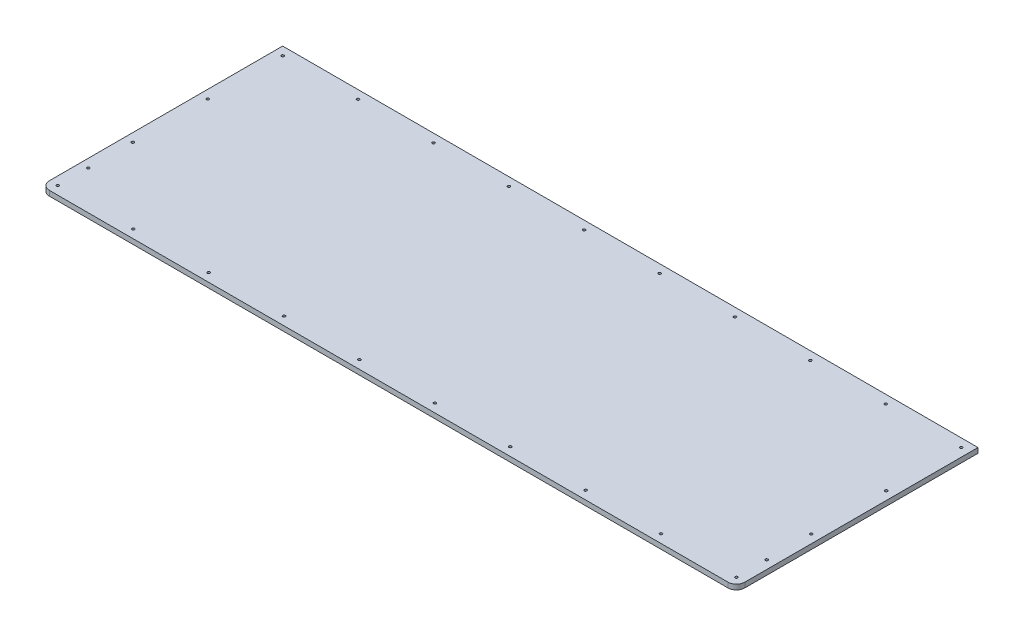
ISO-10303-21;
HEADER;
FILE_DESCRIPTION(('STEP AP214'),'2;1');
FILE_NAME('part.step','',(''),(''),'','','');
FILE_SCHEMA(('AUTOMOTIVE_DESIGN { 1 0 10303 214 1 1 1 1 }'));
ENDSEC;
DATA;
#1=APPLICATION_CONTEXT('core data for automotive mechanical design processes');
#2=APPLICATION_PROTOCOL_DEFINITION('international standard','automotive_design',2000,#1);
#3=PRODUCT_CONTEXT('',#1,'mechanical');
#4=PRODUCT('Part','Part','',(#3));
#5=PRODUCT_RELATED_PRODUCT_CATEGORY('part','',(#4));
#6=PRODUCT_DEFINITION_FORMATION('','',#4);
#7=PRODUCT_DEFINITION_CONTEXT('part definition',#1,'design');
#8=PRODUCT_DEFINITION('design','',#6,#7);
#9=PRODUCT_DEFINITION_SHAPE('','',#8);
#10=(LENGTH_UNIT() NAMED_UNIT(*) SI_UNIT(.MILLI.,.METRE.));
#11=(NAMED_UNIT(*) PLANE_ANGLE_UNIT() SI_UNIT($,.RADIAN.));
#12=(NAMED_UNIT(*) SI_UNIT($,.STERADIAN.) SOLID_ANGLE_UNIT());
#13=UNCERTAINTY_MEASURE_WITH_UNIT(LENGTH_MEASURE(1.E-05),#10,'distance_accuracy_value','');
#14=(GEOMETRIC_REPRESENTATION_CONTEXT(3) GLOBAL_UNCERTAINTY_ASSIGNED_CONTEXT((#13)) GLOBAL_UNIT_ASSIGNED_CONTEXT((#10,
#11,#12)) REPRESENTATION_CONTEXT('',''));
#15=CARTESIAN_POINT('',(0.,0.,0.));
#16=DIRECTION('',(0.,0.,1.));
#17=DIRECTION('',(1.,0.,0.));
#18=AXIS2_PLACEMENT_3D('',#15,#16,#17);
#19=CARTESIAN_POINT('',(-148.314966814714,1511.94738981776,87.0447752973141));
#20=DIRECTION('',(0.,-1.,0.));
#21=DIRECTION('',(0.,0.,-1.));
#22=AXIS2_PLACEMENT_3D('',#19,#20,#21);
#23=CYLINDRICAL_SURFACE('',#22,10.);
#24=CARTESIAN_POINT('',(-148.314966814714,1505.94738981776,87.0447752973141));
#25=DIRECTION('',(0.,1.,0.));
#26=DIRECTION('',(0.,0.,1.));
#27=AXIS2_PLACEMENT_3D('',#24,#25,#26);
#28=CIRCLE('',#27,10.);
#29=CARTESIAN_POINT('',(-158.314966814714,1505.94738981776,87.0447752973141));
#30=VERTEX_POINT('',#29);
#31=CARTESIAN_POINT('',(-148.314966814714,1505.94738981776,97.0447752973141));
#32=VERTEX_POINT('',#31);
#33=EDGE_CURVE('E137',#30,#32,#28,.T.);
#34=ORIENTED_EDGE('',*,*,#33,.T.);
#35=DIRECTION('',(0.,-1.,0.));
#36=VECTOR('',#35,1.);
#37=CARTESIAN_POINT('',(-148.314966814714,1511.94738981776,97.0447752973141));
#38=LINE('',#37,#36);
#39=CARTESIAN_POINT('',(-148.314966814714,1511.94738981776,97.0447752973141));
#40=VERTEX_POINT('',#39);
#41=EDGE_CURVE('E160',#40,#32,#38,.T.);
#42=ORIENTED_EDGE('',*,*,#41,.F.);
#43=CARTESIAN_POINT('',(-148.314966814714,1511.94738981776,87.0447752973141));
#44=DIRECTION('',(0.,1.,0.));
#45=DIRECTION('',(0.,0.,1.));
#46=AXIS2_PLACEMENT_3D('',#43,#44,#45);
#47=CIRCLE('',#46,10.);
#48=CARTESIAN_POINT('',(-158.314966814714,1511.94738981776,87.0447752973141));
#49=VERTEX_POINT('',#48);
#50=EDGE_CURVE('E152',#49,#40,#47,.T.);
#51=ORIENTED_EDGE('',*,*,#50,.F.);
#52=DIRECTION('',(0.,-1.,0.));
#53=VECTOR('',#52,1.);
#54=CARTESIAN_POINT('',(-158.314966814714,1511.94738981776,87.0447752973141));
#55=LINE('',#54,#53);
#56=EDGE_CURVE('E133',#49,#30,#55,.T.);
#57=ORIENTED_EDGE('',*,*,#56,.T.);
#58=EDGE_LOOP('',(#34,#42,#51,#57));
#59=FACE_BOUND('',#58,.T.);
#60=ADVANCED_FACE('F41',(#59),#23,.T.);
#61=CARTESIAN_POINT('',(657.685033185286,1511.94738981776,97.044775297314));
#62=DIRECTION('',(0.,0.,-1.));
#63=DIRECTION('',(-1.,0.,0.));
#64=AXIS2_PLACEMENT_3D('',#61,#62,#63);
#65=PLANE('',#64);
#66=DIRECTION('',(1.,0.,0.));
#67=VECTOR('',#66,1.);
#68=CARTESIAN_POINT('',(657.685033185286,1505.94738981776,97.044775297314));
#69=LINE('',#68,#67);
#70=CARTESIAN_POINT('',(657.685033185286,1505.94738981776,97.044775297314));
#71=VERTEX_POINT('',#70);
#72=EDGE_CURVE('E141',#32,#71,#69,.T.);
#73=ORIENTED_EDGE('',*,*,#72,.T.);
#74=DIRECTION('',(0.,-1.,0.));
#75=VECTOR('',#74,1.);
#76=CARTESIAN_POINT('',(657.685033185286,1511.94738981776,97.044775297314));
#77=LINE('',#76,#75);
#78=CARTESIAN_POINT('',(657.685033185286,1511.94738981776,97.044775297314));
#79=VERTEX_POINT('',#78);
#80=EDGE_CURVE('E157',#79,#71,#77,.T.);
#81=ORIENTED_EDGE('',*,*,#80,.F.);
#82=DIRECTION('',(1.,0.,0.));
#83=VECTOR('',#82,1.);
#84=CARTESIAN_POINT('',(657.685033185286,1511.94738981776,97.044775297314));
#85=LINE('',#84,#83);
#86=EDGE_CURVE('E101',#40,#79,#85,.T.);
#87=ORIENTED_EDGE('',*,*,#86,.F.);
#88=ORIENTED_EDGE('',*,*,#41,.T.);
#89=EDGE_LOOP('',(#73,#81,#87,#88));
#90=FACE_BOUND('',#89,.T.);
#91=ADVANCED_FACE('F234',(#90),#65,.F.);
#92=CARTESIAN_POINT('',(657.685033185286,1511.94738981776,87.044775297314));
#93=DIRECTION('',(0.,-1.,0.));
#94=DIRECTION('',(0.,0.,-1.));
#95=AXIS2_PLACEMENT_3D('',#92,#93,#94);
#96=CYLINDRICAL_SURFACE('',#95,9.99999999999995);
#97=CARTESIAN_POINT('',(657.685033185286,1505.94738981776,87.044775297314));
#98=DIRECTION('',(0.,1.,0.));
#99=DIRECTION('',(0.,0.,-1.));
#100=AXIS2_PLACEMENT_3D('',#97,#98,#99);
#101=CIRCLE('',#100,9.99999999999995);
#102=CARTESIAN_POINT('',(667.685033185286,1505.94738981776,87.044775297314));
#103=VERTEX_POINT('',#102);
#104=EDGE_CURVE('E145',#71,#103,#101,.T.);
#105=ORIENTED_EDGE('',*,*,#104,.T.);
#106=DIRECTION('',(0.,-1.,0.));
#107=VECTOR('',#106,1.);
#108=CARTESIAN_POINT('',(667.685033185286,1511.94738981776,87.044775297314));
#109=LINE('',#108,#107);
#110=CARTESIAN_POINT('',(667.685033185286,1511.94738981776,87.044775297314));
#111=VERTEX_POINT('',#110);
#112=EDGE_CURVE('E124',#111,#103,#109,.T.);
#113=ORIENTED_EDGE('',*,*,#112,.F.);
#114=CARTESIAN_POINT('',(657.685033185286,1511.94738981776,87.044775297314));
#115=DIRECTION('',(0.,1.,0.));
#116=DIRECTION('',(0.,0.,-1.));
#117=AXIS2_PLACEMENT_3D('',#114,#115,#116);
#118=CIRCLE('',#117,9.99999999999995);
#119=EDGE_CURVE('E115',#79,#111,#118,.T.);
#120=ORIENTED_EDGE('',*,*,#119,.F.);
#121=ORIENTED_EDGE('',*,*,#80,.T.);
#122=EDGE_LOOP('',(#105,#113,#120,#121));
#123=FACE_BOUND('',#122,.T.);
#124=ADVANCED_FACE('F240',(#123),#96,.T.);
#125=CARTESIAN_POINT('',(667.685033185286,1511.94738981776,-189.955224702686));
#126=DIRECTION('',(-1.,0.,0.));
#127=DIRECTION('',(0.,0.,1.));
#128=AXIS2_PLACEMENT_3D('',#125,#126,#127);
#129=PLANE('',#128);
#130=DIRECTION('',(0.,0.,-1.));
#131=VECTOR('',#130,1.);
#132=CARTESIAN_POINT('',(667.685033185286,1505.94738981776,-189.955224702686));
#133=LINE('',#132,#131);
#134=CARTESIAN_POINT('',(667.685033185286,1505.94738981776,-189.955224702686));
#135=VERTEX_POINT('',#134);
#136=EDGE_CURVE('E123',#103,#135,#133,.T.);
#137=ORIENTED_EDGE('',*,*,#136,.T.);
#138=DIRECTION('',(0.,-1.,0.));
#139=VECTOR('',#138,1.);
#140=CARTESIAN_POINT('',(667.685033185286,1511.94738981776,-189.955224702686));
#141=LINE('',#140,#139);
#142=CARTESIAN_POINT('',(667.685033185286,1511.94738981776,-189.955224702686));
#143=VERTEX_POINT('',#142);
#144=EDGE_CURVE('E120',#143,#135,#141,.T.);
#145=ORIENTED_EDGE('',*,*,#144,.F.);
#146=DIRECTION('',(0.,0.,-1.));
#147=VECTOR('',#146,1.);
#148=CARTESIAN_POINT('',(667.685033185286,1511.94738981776,-189.955224702686));
#149=LINE('',#148,#147);
#150=EDGE_CURVE('E108',#111,#143,#149,.T.);
#151=ORIENTED_EDGE('',*,*,#150,.F.);
#152=ORIENTED_EDGE('',*,*,#112,.T.);
#153=EDGE_LOOP('',(#137,#145,#151,#152));
#154=FACE_BOUND('',#153,.T.);
#155=ADVANCED_FACE('F121',(#154),#129,.F.);
#156=CARTESIAN_POINT('',(667.685033185286,1511.94738981776,-189.955224702686));
#157=DIRECTION('',(0.,0.,1.));
#158=DIRECTION('',(1.,0.,0.));
#159=AXIS2_PLACEMENT_3D('',#156,#157,#158);
#160=PLANE('',#159);
#161=DIRECTION('',(-1.,0.,0.));
#162=VECTOR('',#161,1.);
#163=CARTESIAN_POINT('',(667.685033185286,1505.94738981776,-189.955224702686));
#164=LINE('',#163,#162);
#165=CARTESIAN_POINT('',(-158.314966814714,1505.94738981776,-189.955224702686));
#166=VERTEX_POINT('',#165);
#167=EDGE_CURVE('E85',#135,#166,#164,.T.);
#168=ORIENTED_EDGE('',*,*,#167,.T.);
#169=DIRECTION('',(0.,-1.,0.));
#170=VECTOR('',#169,1.);
#171=CARTESIAN_POINT('',(-158.314966814714,1511.94738981776,-189.955224702686));
#172=LINE('',#171,#170);
#173=CARTESIAN_POINT('',(-158.314966814714,1511.94738981776,-189.955224702686));
#174=VERTEX_POINT('',#173);
#175=EDGE_CURVE('E125',#174,#166,#172,.T.);
#176=ORIENTED_EDGE('',*,*,#175,.F.);
#177=DIRECTION('',(-1.,0.,0.));
#178=VECTOR('',#177,1.);
#179=CARTESIAN_POINT('',(667.685033185286,1511.94738981776,-189.955224702686));
#180=LINE('',#179,#178);
#181=EDGE_CURVE('E113',#143,#174,#180,.T.);
#182=ORIENTED_EDGE('',*,*,#181,.F.);
#183=ORIENTED_EDGE('',*,*,#144,.T.);
#184=EDGE_LOOP('',(#168,#176,#182,#183));
#185=FACE_BOUND('',#184,.T.);
#186=ADVANCED_FACE('F127',(#185),#160,.F.);
#187=CARTESIAN_POINT('',(-158.314966814714,1511.94738981776,-189.955224702686));
#188=DIRECTION('',(1.,0.,0.));
#189=DIRECTION('',(0.,0.,-1.));
#190=AXIS2_PLACEMENT_3D('',#187,#188,#189);
#191=PLANE('',#190);
#192=DIRECTION('',(0.,0.,1.));
#193=VECTOR('',#192,1.);
#194=CARTESIAN_POINT('',(-158.314966814714,1505.94738981776,-189.955224702686));
#195=LINE('',#194,#193);
#196=EDGE_CURVE('E91',#166,#30,#195,.T.);
#197=ORIENTED_EDGE('',*,*,#196,.T.);
#198=ORIENTED_EDGE('',*,*,#56,.F.);
#199=DIRECTION('',(0.,0.,1.));
#200=VECTOR('',#199,1.);
#201=CARTESIAN_POINT('',(-158.314966814714,1511.94738981776,-189.955224702686));
#202=LINE('',#201,#200);
#203=EDGE_CURVE('E62',#174,#49,#202,.T.);
#204=ORIENTED_EDGE('',*,*,#203,.F.);
#205=ORIENTED_EDGE('',*,*,#175,.T.);
#206=EDGE_LOOP('',(#197,#198,#204,#205));
#207=FACE_BOUND('',#206,.T.);
#208=ADVANCED_FACE('F227',(#207),#191,.F.);
#209=CARTESIAN_POINT('',(-148.314966814714,1511.94738981776,87.0447752973141));
#210=DIRECTION('',(0.,1.,0.));
#211=DIRECTION('',(0.,0.,1.));
#212=AXIS2_PLACEMENT_3D('',#209,#210,#211);
#213=PLANE('',#212);
#214=CARTESIAN_POINT('',(657.685033185286,1511.94738981776,51.0447752973143));
#215=DIRECTION('',(0.,-1.,0.));
#216=DIRECTION('',(0.,0.,-1.));
#217=AXIS2_PLACEMENT_3D('',#214,#215,#216);
#218=CIRCLE('',#217,1.54999999999999);
#219=CARTESIAN_POINT('',(657.685033185286,1511.94738981776,49.4947752973143));
#220=VERTEX_POINT('',#219);
#221=EDGE_CURVE('E570',#220,#220,#218,.T.);
#222=ORIENTED_EDGE('',*,*,#221,.T.);
#223=EDGE_LOOP('',(#222));
#224=FACE_BOUND('',#223,.T.);
#225=CARTESIAN_POINT('',(-58.7549668147139,1511.94738981776,-179.955224702686));
#226=DIRECTION('',(0.,-1.,0.));
#227=DIRECTION('',(0.,0.,-1.));
#228=AXIS2_PLACEMENT_3D('',#225,#226,#227);
#229=CIRCLE('',#228,1.54999999999999);
#230=CARTESIAN_POINT('',(-58.7549668147139,1511.94738981776,-181.505224702686));
#231=VERTEX_POINT('',#230);
#232=EDGE_CURVE('E563',#231,#231,#229,.T.);
#233=ORIENTED_EDGE('',*,*,#232,.T.);
#234=EDGE_LOOP('',(#233));
#235=FACE_BOUND('',#234,.T.);
#236=CARTESIAN_POINT('',(30.8000331852861,1511.94738981776,-179.955224702686));
#237=DIRECTION('',(0.,-1.,0.));
#238=DIRECTION('',(0.,0.,-1.));
#239=AXIS2_PLACEMENT_3D('',#236,#237,#238);
#240=CIRCLE('',#239,1.54999999999999);
#241=CARTESIAN_POINT('',(30.8000331852861,1511.94738981776,-181.505224702686));
#242=VERTEX_POINT('',#241);
#243=EDGE_CURVE('E555',#242,#242,#240,.T.);
#244=ORIENTED_EDGE('',*,*,#243,.T.);
#245=EDGE_LOOP('',(#244));
#246=FACE_BOUND('',#245,.T.);
#247=CARTESIAN_POINT('',(120.355033185286,1511.94738981776,-179.955224702686));
#248=DIRECTION('',(0.,-1.,0.));
#249=DIRECTION('',(0.,0.,-1.));
#250=AXIS2_PLACEMENT_3D('',#247,#248,#249);
#251=CIRCLE('',#250,1.54999999999999);
#252=CARTESIAN_POINT('',(120.355033185286,1511.94738981776,-181.505224702686));
#253=VERTEX_POINT('',#252);
#254=EDGE_CURVE('E548',#253,#253,#251,.T.);
#255=ORIENTED_EDGE('',*,*,#254,.T.);
#256=EDGE_LOOP('',(#255));
#257=FACE_BOUND('',#256,.T.);
#258=CARTESIAN_POINT('',(209.910033185286,1511.94738981776,-179.955224702686));
#259=DIRECTION('',(0.,-1.,0.));
#260=DIRECTION('',(0.,0.,-1.));
#261=AXIS2_PLACEMENT_3D('',#258,#259,#260);
#262=CIRCLE('',#261,1.54999999999999);
#263=CARTESIAN_POINT('',(209.910033185286,1511.94738981776,-181.505224702686));
#264=VERTEX_POINT('',#263);
#265=EDGE_CURVE('E541',#264,#264,#262,.T.);
#266=ORIENTED_EDGE('',*,*,#265,.T.);
#267=EDGE_LOOP('',(#266));
#268=FACE_BOUND('',#267,.T.);
#269=CARTESIAN_POINT('',(299.465033185286,1511.94738981776,-179.955224702686));
#270=DIRECTION('',(0.,-1.,0.));
#271=DIRECTION('',(0.,0.,-1.));
#272=AXIS2_PLACEMENT_3D('',#269,#270,#271);
#273=CIRCLE('',#272,1.54999999999999);
#274=CARTESIAN_POINT('',(299.465033185286,1511.94738981776,-181.505224702686));
#275=VERTEX_POINT('',#274);
#276=EDGE_CURVE('E533',#275,#275,#273,.T.);
#277=ORIENTED_EDGE('',*,*,#276,.T.);
#278=EDGE_LOOP('',(#277));
#279=FACE_BOUND('',#278,.T.);
#280=CARTESIAN_POINT('',(389.020033185286,1511.94738981776,-179.955224702686));
#281=DIRECTION('',(0.,-1.,0.));
#282=DIRECTION('',(0.,0.,-1.));
#283=AXIS2_PLACEMENT_3D('',#280,#281,#282);
#284=CIRCLE('',#283,1.54999999999999);
#285=CARTESIAN_POINT('',(389.020033185286,1511.94738981776,-181.505224702686));
#286=VERTEX_POINT('',#285);
#287=EDGE_CURVE('E526',#286,#286,#284,.T.);
#288=ORIENTED_EDGE('',*,*,#287,.T.);
#289=EDGE_LOOP('',(#288));
#290=FACE_BOUND('',#289,.T.);
#291=CARTESIAN_POINT('',(478.575033185286,1511.94738981776,-179.955224702686));
#292=DIRECTION('',(0.,-1.,0.));
#293=DIRECTION('',(0.,0.,-1.));
#294=AXIS2_PLACEMENT_3D('',#291,#292,#293);
#295=CIRCLE('',#294,1.54999999999999);
#296=CARTESIAN_POINT('',(478.575033185286,1511.94738981776,-181.505224702686));
#297=VERTEX_POINT('',#296);
#298=EDGE_CURVE('E520',#297,#297,#295,.T.);
#299=ORIENTED_EDGE('',*,*,#298,.T.);
#300=EDGE_LOOP('',(#299));
#301=FACE_BOUND('',#300,.T.);
#302=CARTESIAN_POINT('',(568.130033185286,1511.94738981776,-179.955224702686));
#303=DIRECTION('',(0.,-1.,0.));
#304=DIRECTION('',(0.,0.,-1.));
#305=AXIS2_PLACEMENT_3D('',#302,#303,#304);
#306=CIRCLE('',#305,1.54999999999999);
#307=CARTESIAN_POINT('',(568.130033185286,1511.94738981776,-181.505224702686));
#308=VERTEX_POINT('',#307);
#309=EDGE_CURVE('E514',#308,#308,#306,.T.);
#310=ORIENTED_EDGE('',*,*,#309,.T.);
#311=EDGE_LOOP('',(#310));
#312=FACE_BOUND('',#311,.T.);
#313=CARTESIAN_POINT('',(657.685033185286,1511.94738981776,87.0447752973143));
#314=DIRECTION('',(0.,-1.,0.));
#315=DIRECTION('',(0.,0.,-1.));
#316=AXIS2_PLACEMENT_3D('',#313,#314,#315);
#317=CIRCLE('',#316,1.54999999999999);
#318=CARTESIAN_POINT('',(657.685033185286,1511.94738981776,85.4947752973143));
#319=VERTEX_POINT('',#318);
#320=EDGE_CURVE('E508',#319,#319,#317,.T.);
#321=ORIENTED_EDGE('',*,*,#320,.T.);
#322=EDGE_LOOP('',(#321));
#323=FACE_BOUND('',#322,.T.);
#324=CARTESIAN_POINT('',(657.685033185286,1511.94738981776,-1.95522470268575));
#325=DIRECTION('',(0.,-1.,0.));
#326=DIRECTION('',(0.,0.,-1.));
#327=AXIS2_PLACEMENT_3D('',#324,#325,#326);
#328=CIRCLE('',#327,1.54999999999999);
#329=CARTESIAN_POINT('',(657.685033185286,1511.94738981776,-3.50522470268574));
#330=VERTEX_POINT('',#329);
#331=EDGE_CURVE('E502',#330,#330,#328,.T.);
#332=ORIENTED_EDGE('',*,*,#331,.T.);
#333=EDGE_LOOP('',(#332));
#334=FACE_BOUND('',#333,.T.);
#335=CARTESIAN_POINT('',(657.685033185286,1511.94738981776,-90.9552247026857));
#336=DIRECTION('',(0.,-1.,0.));
#337=DIRECTION('',(0.,0.,-1.));
#338=AXIS2_PLACEMENT_3D('',#335,#336,#337);
#339=CIRCLE('',#338,1.54999999999999);
#340=CARTESIAN_POINT('',(657.685033185286,1511.94738981776,-92.5052247026857));
#341=VERTEX_POINT('',#340);
#342=EDGE_CURVE('E496',#341,#341,#339,.T.);
#343=ORIENTED_EDGE('',*,*,#342,.T.);
#344=EDGE_LOOP('',(#343));
#345=FACE_BOUND('',#344,.T.);
#346=CARTESIAN_POINT('',(657.685033185286,1511.94738981776,-179.955224702686));
#347=DIRECTION('',(0.,-1.,0.));
#348=DIRECTION('',(0.,0.,-1.));
#349=AXIS2_PLACEMENT_3D('',#346,#347,#348);
#350=CIRCLE('',#349,1.54999999999999);
#351=CARTESIAN_POINT('',(657.685033185286,1511.94738981776,-181.505224702686));
#352=VERTEX_POINT('',#351);
#353=EDGE_CURVE('E492',#352,#352,#350,.T.);
#354=ORIENTED_EDGE('',*,*,#353,.T.);
#355=EDGE_LOOP('',(#354));
#356=FACE_BOUND('',#355,.T.);
#357=CARTESIAN_POINT('',(-58.7599668147138,1511.94738981776,87.0447752973143));
#358=DIRECTION('',(0.,-1.,0.));
#359=DIRECTION('',(0.,0.,-1.));
#360=AXIS2_PLACEMENT_3D('',#357,#358,#359);
#361=CIRCLE('',#360,1.55000000000005);
#362=CARTESIAN_POINT('',(-58.7599668147138,1511.94738981776,85.4947752973142));
#363=VERTEX_POINT('',#362);
#364=EDGE_CURVE('E488',#363,#363,#361,.T.);
#365=ORIENTED_EDGE('',*,*,#364,.T.);
#366=EDGE_LOOP('',(#365));
#367=FACE_BOUND('',#366,.T.);
#368=CARTESIAN_POINT('',(-148.314966814714,1511.94738981776,51.0447752973143));
#369=DIRECTION('',(0.,-1.,0.));
#370=DIRECTION('',(0.,0.,-1.));
#371=AXIS2_PLACEMENT_3D('',#368,#369,#370);
#372=CIRCLE('',#371,1.55000000000005);
#373=CARTESIAN_POINT('',(-148.314966814714,1511.94738981776,49.4947752973142));
#374=VERTEX_POINT('',#373);
#375=EDGE_CURVE('E474',#374,#374,#372,.T.);
#376=ORIENTED_EDGE('',*,*,#375,.T.);
#377=EDGE_LOOP('',(#376));
#378=FACE_BOUND('',#377,.T.);
#379=CARTESIAN_POINT('',(-148.314966814714,1511.94738981776,-179.955224702686));
#380=DIRECTION('',(0.,-1.,0.));
#381=DIRECTION('',(0.,0.,-1.));
#382=AXIS2_PLACEMENT_3D('',#379,#380,#381);
#383=CIRCLE('',#382,1.55000000000005);
#384=CARTESIAN_POINT('',(-148.314966814714,1511.94738981776,-181.505224702686));
#385=VERTEX_POINT('',#384);
#386=EDGE_CURVE('E468',#385,#385,#383,.T.);
#387=ORIENTED_EDGE('',*,*,#386,.T.);
#388=EDGE_LOOP('',(#387));
#389=FACE_BOUND('',#388,.T.);
#390=CARTESIAN_POINT('',(-148.314966814714,1511.94738981776,-90.9552247026857));
#391=DIRECTION('',(0.,-1.,0.));
#392=DIRECTION('',(0.,0.,-1.));
#393=AXIS2_PLACEMENT_3D('',#390,#391,#392);
#394=CIRCLE('',#393,1.55000000000005);
#395=CARTESIAN_POINT('',(-148.314966814714,1511.94738981776,-92.5052247026858));
#396=VERTEX_POINT('',#395);
#397=EDGE_CURVE('E462',#396,#396,#394,.T.);
#398=ORIENTED_EDGE('',*,*,#397,.T.);
#399=EDGE_LOOP('',(#398));
#400=FACE_BOUND('',#399,.T.);
#401=CARTESIAN_POINT('',(-148.314966814714,1511.94738981776,-1.95522470268572));
#402=DIRECTION('',(0.,-1.,0.));
#403=DIRECTION('',(0.,0.,-1.));
#404=AXIS2_PLACEMENT_3D('',#401,#402,#403);
#405=CIRCLE('',#404,1.55000000000005);
#406=CARTESIAN_POINT('',(-148.314966814714,1511.94738981776,-3.50522470268577));
#407=VERTEX_POINT('',#406);
#408=EDGE_CURVE('E455',#407,#407,#405,.T.);
#409=ORIENTED_EDGE('',*,*,#408,.T.);
#410=EDGE_LOOP('',(#409));
#411=FACE_BOUND('',#410,.T.);
#412=CARTESIAN_POINT('',(-148.314966814714,1511.94738981776,87.0447752973143));
#413=DIRECTION('',(0.,-1.,0.));
#414=DIRECTION('',(0.,0.,-1.));
#415=AXIS2_PLACEMENT_3D('',#412,#413,#414);
#416=CIRCLE('',#415,1.55000000000005);
#417=CARTESIAN_POINT('',(-148.314966814714,1511.94738981776,85.4947752973142));
#418=VERTEX_POINT('',#417);
#419=EDGE_CURVE('E142',#418,#418,#416,.T.);
#420=ORIENTED_EDGE('',*,*,#419,.T.);
#421=EDGE_LOOP('',(#420));
#422=FACE_BOUND('',#421,.T.);
#423=ORIENTED_EDGE('',*,*,#50,.T.);
#424=ORIENTED_EDGE('',*,*,#86,.T.);
#425=ORIENTED_EDGE('',*,*,#119,.T.);
#426=ORIENTED_EDGE('',*,*,#150,.T.);
#427=ORIENTED_EDGE('',*,*,#181,.T.);
#428=ORIENTED_EDGE('',*,*,#203,.T.);
#429=EDGE_LOOP('',(#423,#424,#425,#426,#427,#428));
#430=FACE_BOUND('',#429,.T.);
#431=CARTESIAN_POINT('',(30.7950331852862,1511.94738981776,87.0447752973142));
#432=DIRECTION('',(0.,-1.,0.));
#433=DIRECTION('',(0.,0.,-1.));
#434=AXIS2_PLACEMENT_3D('',#431,#432,#433);
#435=CIRCLE('',#434,1.55000000000005);
#436=CARTESIAN_POINT('',(30.7950331852862,1511.94738981776,85.4947752973142));
#437=VERTEX_POINT('',#436);
#438=EDGE_CURVE('E163',#437,#437,#435,.T.);
#439=ORIENTED_EDGE('',*,*,#438,.T.);
#440=EDGE_LOOP('',(#439));
#441=FACE_BOUND('',#440,.T.);
#442=CARTESIAN_POINT('',(120.350033185286,1511.94738981776,87.0447752973142));
#443=DIRECTION('',(0.,-1.,0.));
#444=DIRECTION('',(0.,0.,-1.));
#445=AXIS2_PLACEMENT_3D('',#442,#443,#444);
#446=CIRCLE('',#445,1.55000000000005);
#447=CARTESIAN_POINT('',(120.350033185286,1511.94738981776,85.4947752973142));
#448=VERTEX_POINT('',#447);
#449=EDGE_CURVE('E171',#448,#448,#446,.T.);
#450=ORIENTED_EDGE('',*,*,#449,.T.);
#451=EDGE_LOOP('',(#450));
#452=FACE_BOUND('',#451,.T.);
#453=CARTESIAN_POINT('',(209.905033185286,1511.94738981776,87.0447752973142));
#454=DIRECTION('',(0.,-1.,0.));
#455=DIRECTION('',(0.,0.,-1.));
#456=AXIS2_PLACEMENT_3D('',#453,#454,#455);
#457=CIRCLE('',#456,1.55000000000005);
#458=CARTESIAN_POINT('',(209.905033185286,1511.94738981776,85.4947752973141));
#459=VERTEX_POINT('',#458);
#460=EDGE_CURVE('E179',#459,#459,#457,.T.);
#461=ORIENTED_EDGE('',*,*,#460,.T.);
#462=EDGE_LOOP('',(#461));
#463=FACE_BOUND('',#462,.T.);
#464=CARTESIAN_POINT('',(299.460033185286,1511.94738981776,87.0447752973142));
#465=DIRECTION('',(0.,-1.,0.));
#466=DIRECTION('',(0.,0.,-1.));
#467=AXIS2_PLACEMENT_3D('',#464,#465,#466);
#468=CIRCLE('',#467,1.55000000000005);
#469=CARTESIAN_POINT('',(299.460033185286,1511.94738981776,85.4947752973141));
#470=VERTEX_POINT('',#469);
#471=EDGE_CURVE('E187',#470,#470,#468,.T.);
#472=ORIENTED_EDGE('',*,*,#471,.T.);
#473=EDGE_LOOP('',(#472));
#474=FACE_BOUND('',#473,.T.);
#475=CARTESIAN_POINT('',(389.015033185286,1511.94738981776,87.0447752973142));
#476=DIRECTION('',(0.,-1.,0.));
#477=DIRECTION('',(0.,0.,-1.));
#478=AXIS2_PLACEMENT_3D('',#475,#476,#477);
#479=CIRCLE('',#478,1.55000000000005);
#480=CARTESIAN_POINT('',(389.015033185286,1511.94738981776,85.4947752973141));
#481=VERTEX_POINT('',#480);
#482=EDGE_CURVE('E193',#481,#481,#479,.T.);
#483=ORIENTED_EDGE('',*,*,#482,.T.);
#484=EDGE_LOOP('',(#483));
#485=FACE_BOUND('',#484,.T.);
#486=CARTESIAN_POINT('',(478.570033185286,1511.94738981776,87.0447752973141));
#487=DIRECTION('',(0.,-1.,0.));
#488=DIRECTION('',(0.,0.,-1.));
#489=AXIS2_PLACEMENT_3D('',#486,#487,#488);
#490=CIRCLE('',#489,1.55000000000005);
#491=CARTESIAN_POINT('',(478.570033185286,1511.94738981776,85.4947752973141));
#492=VERTEX_POINT('',#491);
#493=EDGE_CURVE('E199',#492,#492,#490,.T.);
#494=ORIENTED_EDGE('',*,*,#493,.T.);
#495=EDGE_LOOP('',(#494));
#496=FACE_BOUND('',#495,.T.);
#497=CARTESIAN_POINT('',(568.125033185286,1511.94738981776,87.0447752973141));
#498=DIRECTION('',(0.,-1.,0.));
#499=DIRECTION('',(0.,0.,-1.));
#500=AXIS2_PLACEMENT_3D('',#497,#498,#499);
#501=CIRCLE('',#500,1.55000000000005);
#502=CARTESIAN_POINT('',(568.125033185286,1511.94738981776,85.4947752973141));
#503=VERTEX_POINT('',#502);
#504=EDGE_CURVE('E51',#503,#503,#501,.T.);
#505=ORIENTED_EDGE('',*,*,#504,.T.);
#506=EDGE_LOOP('',(#505));
#507=FACE_BOUND('',#506,.T.);
#508=ADVANCED_FACE('F110',(#224,#235,#246,#257,#268,#279,#290,#301,#312,#323,#334,#345,#356,
#367,#378,#389,#400,#411,#422,#430,#441,#452,#463,#474,#485,#496,#507),#213,.T.);
#509=CARTESIAN_POINT('',(-148.314966814714,1505.94738981776,87.0447752973141));
#510=DIRECTION('',(0.,1.,0.));
#511=DIRECTION('',(0.,0.,1.));
#512=AXIS2_PLACEMENT_3D('',#509,#510,#511);
#513=PLANE('',#512);
#514=CARTESIAN_POINT('',(657.685033185286,1505.94738981776,51.0447752973143));
#515=DIRECTION('',(0.,-1.,0.));
#516=DIRECTION('',(0.,0.,-1.));
#517=AXIS2_PLACEMENT_3D('',#514,#515,#516);
#518=CIRCLE('',#517,1.54999999999999);
#519=CARTESIAN_POINT('',(657.685033185286,1505.94738981776,49.4947752973143));
#520=VERTEX_POINT('',#519);
#521=EDGE_CURVE('E573',#520,#520,#518,.T.);
#522=ORIENTED_EDGE('',*,*,#521,.F.);
#523=EDGE_LOOP('',(#522));
#524=FACE_BOUND('',#523,.T.);
#525=CARTESIAN_POINT('',(-58.7549668147139,1505.94738981776,-179.955224702686));
#526=DIRECTION('',(0.,-1.,0.));
#527=DIRECTION('',(0.,0.,-1.));
#528=AXIS2_PLACEMENT_3D('',#525,#526,#527);
#529=CIRCLE('',#528,1.54999999999999);
#530=CARTESIAN_POINT('',(-58.7549668147139,1505.94738981776,-181.505224702686));
#531=VERTEX_POINT('',#530);
#532=EDGE_CURVE('E567',#531,#531,#529,.T.);
#533=ORIENTED_EDGE('',*,*,#532,.F.);
#534=EDGE_LOOP('',(#533));
#535=FACE_BOUND('',#534,.T.);
#536=CARTESIAN_POINT('',(30.8000331852861,1505.94738981776,-179.955224702686));
#537=DIRECTION('',(0.,-1.,0.));
#538=DIRECTION('',(0.,0.,-1.));
#539=AXIS2_PLACEMENT_3D('',#536,#537,#538);
#540=CIRCLE('',#539,1.54999999999999);
#541=CARTESIAN_POINT('',(30.8000331852861,1505.94738981776,-181.505224702686));
#542=VERTEX_POINT('',#541);
#543=EDGE_CURVE('E559',#542,#542,#540,.T.);
#544=ORIENTED_EDGE('',*,*,#543,.F.);
#545=EDGE_LOOP('',(#544));
#546=FACE_BOUND('',#545,.T.);
#547=CARTESIAN_POINT('',(120.355033185286,1505.94738981776,-179.955224702686));
#548=DIRECTION('',(0.,-1.,0.));
#549=DIRECTION('',(0.,0.,-1.));
#550=AXIS2_PLACEMENT_3D('',#547,#548,#549);
#551=CIRCLE('',#550,1.54999999999999);
#552=CARTESIAN_POINT('',(120.355033185286,1505.94738981776,-181.505224702686));
#553=VERTEX_POINT('',#552);
#554=EDGE_CURVE('E551',#553,#553,#551,.T.);
#555=ORIENTED_EDGE('',*,*,#554,.F.);
#556=EDGE_LOOP('',(#555));
#557=FACE_BOUND('',#556,.T.);
#558=CARTESIAN_POINT('',(209.910033185286,1505.94738981776,-179.955224702686));
#559=DIRECTION('',(0.,-1.,0.));
#560=DIRECTION('',(0.,0.,-1.));
#561=AXIS2_PLACEMENT_3D('',#558,#559,#560);
#562=CIRCLE('',#561,1.54999999999999);
#563=CARTESIAN_POINT('',(209.910033185286,1505.94738981776,-181.505224702686));
#564=VERTEX_POINT('',#563);
#565=EDGE_CURVE('E544',#564,#564,#562,.T.);
#566=ORIENTED_EDGE('',*,*,#565,.F.);
#567=EDGE_LOOP('',(#566));
#568=FACE_BOUND('',#567,.T.);
#569=CARTESIAN_POINT('',(299.465033185286,1505.94738981776,-179.955224702686));
#570=DIRECTION('',(0.,-1.,0.));
#571=DIRECTION('',(0.,0.,-1.));
#572=AXIS2_PLACEMENT_3D('',#569,#570,#571);
#573=CIRCLE('',#572,1.54999999999999);
#574=CARTESIAN_POINT('',(299.465033185286,1505.94738981776,-181.505224702686));
#575=VERTEX_POINT('',#574);
#576=EDGE_CURVE('E537',#575,#575,#573,.T.);
#577=ORIENTED_EDGE('',*,*,#576,.F.);
#578=EDGE_LOOP('',(#577));
#579=FACE_BOUND('',#578,.T.);
#580=CARTESIAN_POINT('',(389.020033185286,1505.94738981776,-179.955224702686));
#581=DIRECTION('',(0.,-1.,0.));
#582=DIRECTION('',(0.,0.,-1.));
#583=AXIS2_PLACEMENT_3D('',#580,#581,#582);
#584=CIRCLE('',#583,1.54999999999999);
#585=CARTESIAN_POINT('',(389.020033185286,1505.94738981776,-181.505224702686));
#586=VERTEX_POINT('',#585);
#587=EDGE_CURVE('E529',#586,#586,#584,.T.);
#588=ORIENTED_EDGE('',*,*,#587,.F.);
#589=EDGE_LOOP('',(#588));
#590=FACE_BOUND('',#589,.T.);
#591=CARTESIAN_POINT('',(478.575033185286,1505.94738981776,-179.955224702686));
#592=DIRECTION('',(0.,-1.,0.));
#593=DIRECTION('',(0.,0.,-1.));
#594=AXIS2_PLACEMENT_3D('',#591,#592,#593);
#595=CIRCLE('',#594,1.54999999999999);
#596=CARTESIAN_POINT('',(478.575033185286,1505.94738981776,-181.505224702686));
#597=VERTEX_POINT('',#596);
#598=EDGE_CURVE('E523',#597,#597,#595,.T.);
#599=ORIENTED_EDGE('',*,*,#598,.F.);
#600=EDGE_LOOP('',(#599));
#601=FACE_BOUND('',#600,.T.);
#602=CARTESIAN_POINT('',(568.130033185286,1505.94738981776,-179.955224702686));
#603=DIRECTION('',(0.,-1.,0.));
#604=DIRECTION('',(0.,0.,-1.));
#605=AXIS2_PLACEMENT_3D('',#602,#603,#604);
#606=CIRCLE('',#605,1.54999999999999);
#607=CARTESIAN_POINT('',(568.130033185286,1505.94738981776,-181.505224702686));
#608=VERTEX_POINT('',#607);
#609=EDGE_CURVE('E517',#608,#608,#606,.T.);
#610=ORIENTED_EDGE('',*,*,#609,.F.);
#611=EDGE_LOOP('',(#610));
#612=FACE_BOUND('',#611,.T.);
#613=CARTESIAN_POINT('',(657.685033185286,1505.94738981776,87.0447752973143));
#614=DIRECTION('',(0.,-1.,0.));
#615=DIRECTION('',(0.,0.,-1.));
#616=AXIS2_PLACEMENT_3D('',#613,#614,#615);
#617=CIRCLE('',#616,1.54999999999999);
#618=CARTESIAN_POINT('',(657.685033185286,1505.94738981776,85.4947752973143));
#619=VERTEX_POINT('',#618);
#620=EDGE_CURVE('E511',#619,#619,#617,.T.);
#621=ORIENTED_EDGE('',*,*,#620,.F.);
#622=EDGE_LOOP('',(#621));
#623=FACE_BOUND('',#622,.T.);
#624=CARTESIAN_POINT('',(657.685033185286,1505.94738981776,-1.95522470268575));
#625=DIRECTION('',(0.,-1.,0.));
#626=DIRECTION('',(0.,0.,-1.));
#627=AXIS2_PLACEMENT_3D('',#624,#625,#626);
#628=CIRCLE('',#627,1.54999999999999);
#629=CARTESIAN_POINT('',(657.685033185286,1505.94738981776,-3.50522470268574));
#630=VERTEX_POINT('',#629);
#631=EDGE_CURVE('E505',#630,#630,#628,.T.);
#632=ORIENTED_EDGE('',*,*,#631,.F.);
#633=EDGE_LOOP('',(#632));
#634=FACE_BOUND('',#633,.T.);
#635=CARTESIAN_POINT('',(657.685033185286,1505.94738981776,-90.9552247026857));
#636=DIRECTION('',(0.,-1.,0.));
#637=DIRECTION('',(0.,0.,-1.));
#638=AXIS2_PLACEMENT_3D('',#635,#636,#637);
#639=CIRCLE('',#638,1.54999999999999);
#640=CARTESIAN_POINT('',(657.685033185286,1505.94738981776,-92.5052247026857));
#641=VERTEX_POINT('',#640);
#642=EDGE_CURVE('E499',#641,#641,#639,.T.);
#643=ORIENTED_EDGE('',*,*,#642,.F.);
#644=EDGE_LOOP('',(#643));
#645=FACE_BOUND('',#644,.T.);
#646=CARTESIAN_POINT('',(657.685033185286,1505.94738981776,-179.955224702686));
#647=DIRECTION('',(0.,-1.,0.));
#648=DIRECTION('',(0.,0.,-1.));
#649=AXIS2_PLACEMENT_3D('',#646,#647,#648);
#650=CIRCLE('',#649,1.54999999999999);
#651=CARTESIAN_POINT('',(657.685033185286,1505.94738981776,-181.505224702686));
#652=VERTEX_POINT('',#651);
#653=EDGE_CURVE('E493',#652,#652,#650,.T.);
#654=ORIENTED_EDGE('',*,*,#653,.F.);
#655=EDGE_LOOP('',(#654));
#656=FACE_BOUND('',#655,.T.);
#657=CARTESIAN_POINT('',(-58.7599668147138,1505.94738981776,87.0447752973143));
#658=DIRECTION('',(0.,-1.,0.));
#659=DIRECTION('',(0.,0.,-1.));
#660=AXIS2_PLACEMENT_3D('',#657,#658,#659);
#661=CIRCLE('',#660,1.55000000000005);
#662=CARTESIAN_POINT('',(-58.7599668147138,1505.94738981776,85.4947752973142));
#663=VERTEX_POINT('',#662);
#664=EDGE_CURVE('E481',#663,#663,#661,.T.);
#665=ORIENTED_EDGE('',*,*,#664,.F.);
#666=EDGE_LOOP('',(#665));
#667=FACE_BOUND('',#666,.T.);
#668=CARTESIAN_POINT('',(-148.314966814714,1505.94738981776,51.0447752973143));
#669=DIRECTION('',(0.,-1.,0.));
#670=DIRECTION('',(0.,0.,-1.));
#671=AXIS2_PLACEMENT_3D('',#668,#669,#670);
#672=CIRCLE('',#671,1.55000000000005);
#673=CARTESIAN_POINT('',(-148.314966814714,1505.94738981776,49.4947752973142));
#674=VERTEX_POINT('',#673);
#675=EDGE_CURVE('E477',#674,#674,#672,.T.);
#676=ORIENTED_EDGE('',*,*,#675,.F.);
#677=EDGE_LOOP('',(#676));
#678=FACE_BOUND('',#677,.T.);
#679=CARTESIAN_POINT('',(-148.314966814714,1505.94738981776,-179.955224702686));
#680=DIRECTION('',(0.,-1.,0.));
#681=DIRECTION('',(0.,0.,-1.));
#682=AXIS2_PLACEMENT_3D('',#679,#680,#681);
#683=CIRCLE('',#682,1.55000000000005);
#684=CARTESIAN_POINT('',(-148.314966814714,1505.94738981776,-181.505224702686));
#685=VERTEX_POINT('',#684);
#686=EDGE_CURVE('E471',#685,#685,#683,.T.);
#687=ORIENTED_EDGE('',*,*,#686,.F.);
#688=EDGE_LOOP('',(#687));
#689=FACE_BOUND('',#688,.T.);
#690=CARTESIAN_POINT('',(-148.314966814714,1505.94738981776,-90.9552247026857));
#691=DIRECTION('',(0.,-1.,0.));
#692=DIRECTION('',(0.,0.,-1.));
#693=AXIS2_PLACEMENT_3D('',#690,#691,#692);
#694=CIRCLE('',#693,1.55000000000005);
#695=CARTESIAN_POINT('',(-148.314966814714,1505.94738981776,-92.5052247026858));
#696=VERTEX_POINT('',#695);
#697=EDGE_CURVE('E465',#696,#696,#694,.T.);
#698=ORIENTED_EDGE('',*,*,#697,.F.);
#699=EDGE_LOOP('',(#698));
#700=FACE_BOUND('',#699,.T.);
#701=CARTESIAN_POINT('',(-148.314966814714,1505.94738981776,-1.95522470268572));
#702=DIRECTION('',(0.,-1.,0.));
#703=DIRECTION('',(0.,0.,-1.));
#704=AXIS2_PLACEMENT_3D('',#701,#702,#703);
#705=CIRCLE('',#704,1.55000000000005);
#706=CARTESIAN_POINT('',(-148.314966814714,1505.94738981776,-3.50522470268577));
#707=VERTEX_POINT('',#706);
#708=EDGE_CURVE('E459',#707,#707,#705,.T.);
#709=ORIENTED_EDGE('',*,*,#708,.F.);
#710=EDGE_LOOP('',(#709));
#711=FACE_BOUND('',#710,.T.);
#712=CARTESIAN_POINT('',(-148.314966814714,1505.94738981776,87.0447752973143));
#713=DIRECTION('',(0.,-1.,0.));
#714=DIRECTION('',(0.,0.,-1.));
#715=AXIS2_PLACEMENT_3D('',#712,#713,#714);
#716=CIRCLE('',#715,1.55000000000005);
#717=CARTESIAN_POINT('',(-148.314966814714,1505.94738981776,85.4947752973142));
#718=VERTEX_POINT('',#717);
#719=EDGE_CURVE('E451',#718,#718,#716,.T.);
#720=ORIENTED_EDGE('',*,*,#719,.F.);
#721=EDGE_LOOP('',(#720));
#722=FACE_BOUND('',#721,.T.);
#723=ORIENTED_EDGE('',*,*,#33,.F.);
#724=ORIENTED_EDGE('',*,*,#196,.F.);
#725=ORIENTED_EDGE('',*,*,#167,.F.);
#726=ORIENTED_EDGE('',*,*,#136,.F.);
#727=ORIENTED_EDGE('',*,*,#104,.F.);
#728=ORIENTED_EDGE('',*,*,#72,.F.);
#729=EDGE_LOOP('',(#723,#724,#725,#726,#727,#728));
#730=FACE_BOUND('',#729,.T.);
#731=CARTESIAN_POINT('',(30.7950331852862,1505.94738981776,87.0447752973142));
#732=DIRECTION('',(0.,-1.,0.));
#733=DIRECTION('',(0.,0.,-1.));
#734=AXIS2_PLACEMENT_3D('',#731,#732,#733);
#735=CIRCLE('',#734,1.55000000000005);
#736=CARTESIAN_POINT('',(30.7950331852862,1505.94738981776,85.4947752973142));
#737=VERTEX_POINT('',#736);
#738=EDGE_CURVE('E167',#737,#737,#735,.T.);
#739=ORIENTED_EDGE('',*,*,#738,.F.);
#740=EDGE_LOOP('',(#739));
#741=FACE_BOUND('',#740,.T.);
#742=CARTESIAN_POINT('',(120.350033185286,1505.94738981776,87.0447752973142));
#743=DIRECTION('',(0.,-1.,0.));
#744=DIRECTION('',(0.,0.,-1.));
#745=AXIS2_PLACEMENT_3D('',#742,#743,#744);
#746=CIRCLE('',#745,1.55000000000005);
#747=CARTESIAN_POINT('',(120.350033185286,1505.94738981776,85.4947752973142));
#748=VERTEX_POINT('',#747);
#749=EDGE_CURVE('E175',#748,#748,#746,.T.);
#750=ORIENTED_EDGE('',*,*,#749,.F.);
#751=EDGE_LOOP('',(#750));
#752=FACE_BOUND('',#751,.T.);
#753=CARTESIAN_POINT('',(209.905033185286,1505.94738981776,87.0447752973142));
#754=DIRECTION('',(0.,-1.,0.));
#755=DIRECTION('',(0.,0.,-1.));
#756=AXIS2_PLACEMENT_3D('',#753,#754,#755);
#757=CIRCLE('',#756,1.55000000000005);
#758=CARTESIAN_POINT('',(209.905033185286,1505.94738981776,85.4947752973141));
#759=VERTEX_POINT('',#758);
#760=EDGE_CURVE('E183',#759,#759,#757,.T.);
#761=ORIENTED_EDGE('',*,*,#760,.F.);
#762=EDGE_LOOP('',(#761));
#763=FACE_BOUND('',#762,.T.);
#764=CARTESIAN_POINT('',(299.460033185286,1505.94738981776,87.0447752973142));
#765=DIRECTION('',(0.,-1.,0.));
#766=DIRECTION('',(0.,0.,-1.));
#767=AXIS2_PLACEMENT_3D('',#764,#765,#766);
#768=CIRCLE('',#767,1.55000000000005);
#769=CARTESIAN_POINT('',(299.460033185286,1505.94738981776,85.4947752973141));
#770=VERTEX_POINT('',#769);
#771=EDGE_CURVE('E190',#770,#770,#768,.T.);
#772=ORIENTED_EDGE('',*,*,#771,.F.);
#773=EDGE_LOOP('',(#772));
#774=FACE_BOUND('',#773,.T.);
#775=CARTESIAN_POINT('',(389.015033185286,1505.94738981776,87.0447752973142));
#776=DIRECTION('',(0.,-1.,0.));
#777=DIRECTION('',(0.,0.,-1.));
#778=AXIS2_PLACEMENT_3D('',#775,#776,#777);
#779=CIRCLE('',#778,1.55000000000005);
#780=CARTESIAN_POINT('',(389.015033185286,1505.94738981776,85.4947752973141));
#781=VERTEX_POINT('',#780);
#782=EDGE_CURVE('E196',#781,#781,#779,.T.);
#783=ORIENTED_EDGE('',*,*,#782,.F.);
#784=EDGE_LOOP('',(#783));
#785=FACE_BOUND('',#784,.T.);
#786=CARTESIAN_POINT('',(478.570033185286,1505.94738981776,87.0447752973141));
#787=DIRECTION('',(0.,-1.,0.));
#788=DIRECTION('',(0.,0.,-1.));
#789=AXIS2_PLACEMENT_3D('',#786,#787,#788);
#790=CIRCLE('',#789,1.55000000000005);
#791=CARTESIAN_POINT('',(478.570033185286,1505.94738981776,85.4947752973141));
#792=VERTEX_POINT('',#791);
#793=EDGE_CURVE('E202',#792,#792,#790,.T.);
#794=ORIENTED_EDGE('',*,*,#793,.F.);
#795=EDGE_LOOP('',(#794));
#796=FACE_BOUND('',#795,.T.);
#797=CARTESIAN_POINT('',(568.125033185286,1505.94738981776,87.0447752973141));
#798=DIRECTION('',(0.,-1.,0.));
#799=DIRECTION('',(0.,0.,-1.));
#800=AXIS2_PLACEMENT_3D('',#797,#798,#799);
#801=CIRCLE('',#800,1.55000000000005);
#802=CARTESIAN_POINT('',(568.125033185286,1505.94738981776,85.4947752973141));
#803=VERTEX_POINT('',#802);
#804=EDGE_CURVE('E11',#803,#803,#801,.T.);
#805=ORIENTED_EDGE('',*,*,#804,.F.);
#806=EDGE_LOOP('',(#805));
#807=FACE_BOUND('',#806,.T.);
#808=ADVANCED_FACE('F215',(#524,#535,#546,#557,#568,#579,#590,#601,#612,#623,#634,#645,#656,
#667,#678,#689,#700,#711,#722,#730,#741,#752,#763,#774,#785,#796,#807),#513,.F.);
#809=CARTESIAN_POINT('',(-148.314966814714,1511.94738981776,87.0447752973143));
#810=DIRECTION('',(0.,-1.,0.));
#811=DIRECTION('',(0.,0.,-1.));
#812=AXIS2_PLACEMENT_3D('',#809,#810,#811);
#813=CYLINDRICAL_SURFACE('',#812,1.55000000000005);
#814=ORIENTED_EDGE('',*,*,#419,.F.);
#815=EDGE_LOOP('',(#814));
#816=FACE_BOUND('',#815,.T.);
#817=ORIENTED_EDGE('',*,*,#719,.T.);
#818=EDGE_LOOP('',(#817));
#819=FACE_BOUND('',#818,.T.);
#820=ADVANCED_FACE('F217',(#816,#819),#813,.F.);
#821=CARTESIAN_POINT('',(-148.314966814714,1511.94738981776,-1.95522470268572));
#822=DIRECTION('',(0.,-1.,0.));
#823=DIRECTION('',(0.,0.,-1.));
#824=AXIS2_PLACEMENT_3D('',#821,#822,#823);
#825=CYLINDRICAL_SURFACE('',#824,1.55000000000005);
#826=ORIENTED_EDGE('',*,*,#408,.F.);
#827=EDGE_LOOP('',(#826));
#828=FACE_BOUND('',#827,.T.);
#829=ORIENTED_EDGE('',*,*,#708,.T.);
#830=EDGE_LOOP('',(#829));
#831=FACE_BOUND('',#830,.T.);
#832=ADVANCED_FACE('F224',(#828,#831),#825,.F.);
#833=CARTESIAN_POINT('',(-148.314966814714,1511.94738981776,-90.9552247026857));
#834=DIRECTION('',(0.,-1.,0.));
#835=DIRECTION('',(0.,0.,-1.));
#836=AXIS2_PLACEMENT_3D('',#833,#834,#835);
#837=CYLINDRICAL_SURFACE('',#836,1.55000000000005);
#838=ORIENTED_EDGE('',*,*,#397,.F.);
#839=EDGE_LOOP('',(#838));
#840=FACE_BOUND('',#839,.T.);
#841=ORIENTED_EDGE('',*,*,#697,.T.);
#842=EDGE_LOOP('',(#841));
#843=FACE_BOUND('',#842,.T.);
#844=ADVANCED_FACE('F621',(#840,#843),#837,.F.);
#845=CARTESIAN_POINT('',(-148.314966814714,1511.94738981776,-179.955224702686));
#846=DIRECTION('',(0.,-1.,0.));
#847=DIRECTION('',(0.,0.,-1.));
#848=AXIS2_PLACEMENT_3D('',#845,#846,#847);
#849=CYLINDRICAL_SURFACE('',#848,1.55000000000005);
#850=ORIENTED_EDGE('',*,*,#386,.F.);
#851=EDGE_LOOP('',(#850));
#852=FACE_BOUND('',#851,.T.);
#853=ORIENTED_EDGE('',*,*,#686,.T.);
#854=EDGE_LOOP('',(#853));
#855=FACE_BOUND('',#854,.T.);
#856=ADVANCED_FACE('F628',(#852,#855),#849,.F.);
#857=CARTESIAN_POINT('',(-148.314966814714,1511.94738981776,51.0447752973143));
#858=DIRECTION('',(0.,-1.,0.));
#859=DIRECTION('',(0.,0.,-1.));
#860=AXIS2_PLACEMENT_3D('',#857,#858,#859);
#861=CYLINDRICAL_SURFACE('',#860,1.55000000000005);
#862=ORIENTED_EDGE('',*,*,#375,.F.);
#863=EDGE_LOOP('',(#862));
#864=FACE_BOUND('',#863,.T.);
#865=ORIENTED_EDGE('',*,*,#675,.T.);
#866=EDGE_LOOP('',(#865));
#867=FACE_BOUND('',#866,.T.);
#868=ADVANCED_FACE('F634',(#864,#867),#861,.F.);
#869=CARTESIAN_POINT('',(-58.7599668147138,1511.94738981776,87.0447752973143));
#870=DIRECTION('',(0.,-1.,0.));
#871=DIRECTION('',(0.,0.,-1.));
#872=AXIS2_PLACEMENT_3D('',#869,#870,#871);
#873=CYLINDRICAL_SURFACE('',#872,1.55000000000005);
#874=ORIENTED_EDGE('',*,*,#364,.F.);
#875=EDGE_LOOP('',(#874));
#876=FACE_BOUND('',#875,.T.);
#877=ORIENTED_EDGE('',*,*,#664,.T.);
#878=EDGE_LOOP('',(#877));
#879=FACE_BOUND('',#878,.T.);
#880=ADVANCED_FACE('F248',(#876,#879),#873,.F.);
#881=CARTESIAN_POINT('',(30.7950331852862,1511.94738981776,87.0447752973142));
#882=DIRECTION('',(0.,-1.,0.));
#883=DIRECTION('',(0.,0.,-1.));
#884=AXIS2_PLACEMENT_3D('',#881,#882,#883);
#885=CYLINDRICAL_SURFACE('',#884,1.55000000000005);
#886=ORIENTED_EDGE('',*,*,#438,.F.);
#887=EDGE_LOOP('',(#886));
#888=FACE_BOUND('',#887,.T.);
#889=ORIENTED_EDGE('',*,*,#738,.T.);
#890=EDGE_LOOP('',(#889));
#891=FACE_BOUND('',#890,.T.);
#892=ADVANCED_FACE('F244',(#888,#891),#885,.F.);
#893=CARTESIAN_POINT('',(120.350033185286,1511.94738981776,87.0447752973142));
#894=DIRECTION('',(0.,-1.,0.));
#895=DIRECTION('',(0.,0.,-1.));
#896=AXIS2_PLACEMENT_3D('',#893,#894,#895);
#897=CYLINDRICAL_SURFACE('',#896,1.55000000000005);
#898=ORIENTED_EDGE('',*,*,#449,.F.);
#899=EDGE_LOOP('',(#898));
#900=FACE_BOUND('',#899,.T.);
#901=ORIENTED_EDGE('',*,*,#749,.T.);
#902=EDGE_LOOP('',(#901));
#903=FACE_BOUND('',#902,.T.);
#904=ADVANCED_FACE('F247',(#900,#903),#897,.F.);
#905=CARTESIAN_POINT('',(209.905033185286,1511.94738981776,87.0447752973142));
#906=DIRECTION('',(0.,-1.,0.));
#907=DIRECTION('',(0.,0.,-1.));
#908=AXIS2_PLACEMENT_3D('',#905,#906,#907);
#909=CYLINDRICAL_SURFACE('',#908,1.55000000000005);
#910=ORIENTED_EDGE('',*,*,#460,.F.);
#911=EDGE_LOOP('',(#910));
#912=FACE_BOUND('',#911,.T.);
#913=ORIENTED_EDGE('',*,*,#760,.T.);
#914=EDGE_LOOP('',(#913));
#915=FACE_BOUND('',#914,.T.);
#916=ADVANCED_FACE('F252',(#912,#915),#909,.F.);
#917=CARTESIAN_POINT('',(299.460033185286,1511.94738981776,87.0447752973142));
#918=DIRECTION('',(0.,-1.,0.));
#919=DIRECTION('',(0.,0.,-1.));
#920=AXIS2_PLACEMENT_3D('',#917,#918,#919);
#921=CYLINDRICAL_SURFACE('',#920,1.55000000000005);
#922=ORIENTED_EDGE('',*,*,#471,.F.);
#923=EDGE_LOOP('',(#922));
#924=FACE_BOUND('',#923,.T.);
#925=ORIENTED_EDGE('',*,*,#771,.T.);
#926=EDGE_LOOP('',(#925));
#927=FACE_BOUND('',#926,.T.);
#928=ADVANCED_FACE('F256',(#924,#927),#921,.F.);
#929=CARTESIAN_POINT('',(389.015033185286,1511.94738981776,87.0447752973142));
#930=DIRECTION('',(0.,-1.,0.));
#931=DIRECTION('',(0.,0.,-1.));
#932=AXIS2_PLACEMENT_3D('',#929,#930,#931);
#933=CYLINDRICAL_SURFACE('',#932,1.55000000000005);
#934=ORIENTED_EDGE('',*,*,#482,.F.);
#935=EDGE_LOOP('',(#934));
#936=FACE_BOUND('',#935,.T.);
#937=ORIENTED_EDGE('',*,*,#782,.T.);
#938=EDGE_LOOP('',(#937));
#939=FACE_BOUND('',#938,.T.);
#940=ADVANCED_FACE('F260',(#936,#939),#933,.F.);
#941=CARTESIAN_POINT('',(478.570033185286,1511.94738981776,87.0447752973141));
#942=DIRECTION('',(0.,-1.,0.));
#943=DIRECTION('',(0.,0.,-1.));
#944=AXIS2_PLACEMENT_3D('',#941,#942,#943);
#945=CYLINDRICAL_SURFACE('',#944,1.55000000000005);
#946=ORIENTED_EDGE('',*,*,#493,.F.);
#947=EDGE_LOOP('',(#946));
#948=FACE_BOUND('',#947,.T.);
#949=ORIENTED_EDGE('',*,*,#793,.T.);
#950=EDGE_LOOP('',(#949));
#951=FACE_BOUND('',#950,.T.);
#952=ADVANCED_FACE('F212',(#948,#951),#945,.F.);
#953=CARTESIAN_POINT('',(568.125033185286,1511.94738981776,87.0447752973141));
#954=DIRECTION('',(0.,-1.,0.));
#955=DIRECTION('',(0.,0.,-1.));
#956=AXIS2_PLACEMENT_3D('',#953,#954,#955);
#957=CYLINDRICAL_SURFACE('',#956,1.55000000000005);
#958=ORIENTED_EDGE('',*,*,#504,.F.);
#959=EDGE_LOOP('',(#958));
#960=FACE_BOUND('',#959,.T.);
#961=ORIENTED_EDGE('',*,*,#804,.T.);
#962=EDGE_LOOP('',(#961));
#963=FACE_BOUND('',#962,.T.);
#964=ADVANCED_FACE('F43',(#960,#963),#957,.F.);
#965=CARTESIAN_POINT('',(657.685033185286,1511.94738981776,-179.955224702686));
#966=DIRECTION('',(0.,-1.,0.));
#967=DIRECTION('',(0.,0.,-1.));
#968=AXIS2_PLACEMENT_3D('',#965,#966,#967);
#969=CYLINDRICAL_SURFACE('',#968,1.54999999999999);
#970=ORIENTED_EDGE('',*,*,#353,.F.);
#971=EDGE_LOOP('',(#970));
#972=FACE_BOUND('',#971,.T.);
#973=ORIENTED_EDGE('',*,*,#653,.T.);
#974=EDGE_LOOP('',(#973));
#975=FACE_BOUND('',#974,.T.);
#976=ADVANCED_FACE('F211',(#972,#975),#969,.F.);
#977=CARTESIAN_POINT('',(657.685033185286,1511.94738981776,-90.9552247026857));
#978=DIRECTION('',(0.,-1.,0.));
#979=DIRECTION('',(0.,0.,-1.));
#980=AXIS2_PLACEMENT_3D('',#977,#978,#979);
#981=CYLINDRICAL_SURFACE('',#980,1.54999999999999);
#982=ORIENTED_EDGE('',*,*,#342,.F.);
#983=EDGE_LOOP('',(#982));
#984=FACE_BOUND('',#983,.T.);
#985=ORIENTED_EDGE('',*,*,#642,.T.);
#986=EDGE_LOOP('',(#985));
#987=FACE_BOUND('',#986,.T.);
#988=ADVANCED_FACE('F284',(#984,#987),#981,.F.);
#989=CARTESIAN_POINT('',(657.685033185286,1511.94738981776,-1.95522470268575));
#990=DIRECTION('',(0.,-1.,0.));
#991=DIRECTION('',(0.,0.,-1.));
#992=AXIS2_PLACEMENT_3D('',#989,#990,#991);
#993=CYLINDRICAL_SURFACE('',#992,1.54999999999999);
#994=ORIENTED_EDGE('',*,*,#331,.F.);
#995=EDGE_LOOP('',(#994));
#996=FACE_BOUND('',#995,.T.);
#997=ORIENTED_EDGE('',*,*,#631,.T.);
#998=EDGE_LOOP('',(#997));
#999=FACE_BOUND('',#998,.T.);
#1000=ADVANCED_FACE('F292',(#996,#999),#993,.F.);
#1001=CARTESIAN_POINT('',(657.685033185286,1511.94738981776,87.0447752973143));
#1002=DIRECTION('',(0.,-1.,0.));
#1003=DIRECTION('',(0.,0.,-1.));
#1004=AXIS2_PLACEMENT_3D('',#1001,#1002,#1003);
#1005=CYLINDRICAL_SURFACE('',#1004,1.54999999999999);
#1006=ORIENTED_EDGE('',*,*,#320,.F.);
#1007=EDGE_LOOP('',(#1006));
#1008=FACE_BOUND('',#1007,.T.);
#1009=ORIENTED_EDGE('',*,*,#620,.T.);
#1010=EDGE_LOOP('',(#1009));
#1011=FACE_BOUND('',#1010,.T.);
#1012=ADVANCED_FACE('F300',(#1008,#1011),#1005,.F.);
#1013=CARTESIAN_POINT('',(568.130033185286,1511.94738981776,-179.955224702686));
#1014=DIRECTION('',(0.,-1.,0.));
#1015=DIRECTION('',(0.,0.,-1.));
#1016=AXIS2_PLACEMENT_3D('',#1013,#1014,#1015);
#1017=CYLINDRICAL_SURFACE('',#1016,1.54999999999999);
#1018=ORIENTED_EDGE('',*,*,#309,.F.);
#1019=EDGE_LOOP('',(#1018));
#1020=FACE_BOUND('',#1019,.T.);
#1021=ORIENTED_EDGE('',*,*,#609,.T.);
#1022=EDGE_LOOP('',(#1021));
#1023=FACE_BOUND('',#1022,.T.);
#1024=ADVANCED_FACE('F308',(#1020,#1023),#1017,.F.);
#1025=CARTESIAN_POINT('',(478.575033185286,1511.94738981776,-179.955224702686));
#1026=DIRECTION('',(0.,-1.,0.));
#1027=DIRECTION('',(0.,0.,-1.));
#1028=AXIS2_PLACEMENT_3D('',#1025,#1026,#1027);
#1029=CYLINDRICAL_SURFACE('',#1028,1.54999999999999);
#1030=ORIENTED_EDGE('',*,*,#298,.F.);
#1031=EDGE_LOOP('',(#1030));
#1032=FACE_BOUND('',#1031,.T.);
#1033=ORIENTED_EDGE('',*,*,#598,.T.);
#1034=EDGE_LOOP('',(#1033));
#1035=FACE_BOUND('',#1034,.T.);
#1036=ADVANCED_FACE('F316',(#1032,#1035),#1029,.F.);
#1037=CARTESIAN_POINT('',(389.020033185286,1511.94738981776,-179.955224702686));
#1038=DIRECTION('',(0.,-1.,0.));
#1039=DIRECTION('',(0.,0.,-1.));
#1040=AXIS2_PLACEMENT_3D('',#1037,#1038,#1039);
#1041=CYLINDRICAL_SURFACE('',#1040,1.54999999999999);
#1042=ORIENTED_EDGE('',*,*,#287,.F.);
#1043=EDGE_LOOP('',(#1042));
#1044=FACE_BOUND('',#1043,.T.);
#1045=ORIENTED_EDGE('',*,*,#587,.T.);
#1046=EDGE_LOOP('',(#1045));
#1047=FACE_BOUND('',#1046,.T.);
#1048=ADVANCED_FACE('F324',(#1044,#1047),#1041,.F.);
#1049=CARTESIAN_POINT('',(299.465033185286,1511.94738981776,-179.955224702686));
#1050=DIRECTION('',(0.,-1.,0.));
#1051=DIRECTION('',(0.,0.,-1.));
#1052=AXIS2_PLACEMENT_3D('',#1049,#1050,#1051);
#1053=CYLINDRICAL_SURFACE('',#1052,1.54999999999999);
#1054=ORIENTED_EDGE('',*,*,#276,.F.);
#1055=EDGE_LOOP('',(#1054));
#1056=FACE_BOUND('',#1055,.T.);
#1057=ORIENTED_EDGE('',*,*,#576,.T.);
#1058=EDGE_LOOP('',(#1057));
#1059=FACE_BOUND('',#1058,.T.);
#1060=ADVANCED_FACE('F332',(#1056,#1059),#1053,.F.);
#1061=CARTESIAN_POINT('',(209.910033185286,1511.94738981776,-179.955224702686));
#1062=DIRECTION('',(0.,-1.,0.));
#1063=DIRECTION('',(0.,0.,-1.));
#1064=AXIS2_PLACEMENT_3D('',#1061,#1062,#1063);
#1065=CYLINDRICAL_SURFACE('',#1064,1.54999999999999);
#1066=ORIENTED_EDGE('',*,*,#265,.F.);
#1067=EDGE_LOOP('',(#1066));
#1068=FACE_BOUND('',#1067,.T.);
#1069=ORIENTED_EDGE('',*,*,#565,.T.);
#1070=EDGE_LOOP('',(#1069));
#1071=FACE_BOUND('',#1070,.T.);
#1072=ADVANCED_FACE('F340',(#1068,#1071),#1065,.F.);
#1073=CARTESIAN_POINT('',(120.355033185286,1511.94738981776,-179.955224702686));
#1074=DIRECTION('',(0.,-1.,0.));
#1075=DIRECTION('',(0.,0.,-1.));
#1076=AXIS2_PLACEMENT_3D('',#1073,#1074,#1075);
#1077=CYLINDRICAL_SURFACE('',#1076,1.54999999999999);
#1078=ORIENTED_EDGE('',*,*,#254,.F.);
#1079=EDGE_LOOP('',(#1078));
#1080=FACE_BOUND('',#1079,.T.);
#1081=ORIENTED_EDGE('',*,*,#554,.T.);
#1082=EDGE_LOOP('',(#1081));
#1083=FACE_BOUND('',#1082,.T.);
#1084=ADVANCED_FACE('F348',(#1080,#1083),#1077,.F.);
#1085=CARTESIAN_POINT('',(30.8000331852861,1511.94738981776,-179.955224702686));
#1086=DIRECTION('',(0.,-1.,0.));
#1087=DIRECTION('',(0.,0.,-1.));
#1088=AXIS2_PLACEMENT_3D('',#1085,#1086,#1087);
#1089=CYLINDRICAL_SURFACE('',#1088,1.54999999999999);
#1090=ORIENTED_EDGE('',*,*,#243,.F.);
#1091=EDGE_LOOP('',(#1090));
#1092=FACE_BOUND('',#1091,.T.);
#1093=ORIENTED_EDGE('',*,*,#543,.T.);
#1094=EDGE_LOOP('',(#1093));
#1095=FACE_BOUND('',#1094,.T.);
#1096=ADVANCED_FACE('F356',(#1092,#1095),#1089,.F.);
#1097=CARTESIAN_POINT('',(-58.7549668147139,1511.94738981776,-179.955224702686));
#1098=DIRECTION('',(0.,-1.,0.));
#1099=DIRECTION('',(0.,0.,-1.));
#1100=AXIS2_PLACEMENT_3D('',#1097,#1098,#1099);
#1101=CYLINDRICAL_SURFACE('',#1100,1.54999999999999);
#1102=ORIENTED_EDGE('',*,*,#232,.F.);
#1103=EDGE_LOOP('',(#1102));
#1104=FACE_BOUND('',#1103,.T.);
#1105=ORIENTED_EDGE('',*,*,#532,.T.);
#1106=EDGE_LOOP('',(#1105));
#1107=FACE_BOUND('',#1106,.T.);
#1108=ADVANCED_FACE('F364',(#1104,#1107),#1101,.F.);
#1109=CARTESIAN_POINT('',(657.685033185286,1511.94738981776,51.0447752973143));
#1110=DIRECTION('',(0.,-1.,0.));
#1111=DIRECTION('',(0.,0.,-1.));
#1112=AXIS2_PLACEMENT_3D('',#1109,#1110,#1111);
#1113=CYLINDRICAL_SURFACE('',#1112,1.54999999999999);
#1114=ORIENTED_EDGE('',*,*,#221,.F.);
#1115=EDGE_LOOP('',(#1114));
#1116=FACE_BOUND('',#1115,.T.);
#1117=ORIENTED_EDGE('',*,*,#521,.T.);
#1118=EDGE_LOOP('',(#1117));
#1119=FACE_BOUND('',#1118,.T.);
#1120=ADVANCED_FACE('F372',(#1116,#1119),#1113,.F.);
#1121=CLOSED_SHELL('',(#60,#91,#124,#155,#186,#208,#508,#808,#820,#832,#844,#856,#868,#880,#892,
#904,#916,#928,#940,#952,#964,#976,#988,#1000,#1012,#1024,#1036,#1048,#1060,#1072,#1084,#1096,
#1108,#1120));
#1122=MANIFOLD_SOLID_BREP('B2',#1121);
#1123=ADVANCED_BREP_SHAPE_REPRESENTATION('',(#18,#1122),#14);
#1124=SHAPE_DEFINITION_REPRESENTATION(#9,#1123);
ENDSEC;
END-ISO-10303-21;
